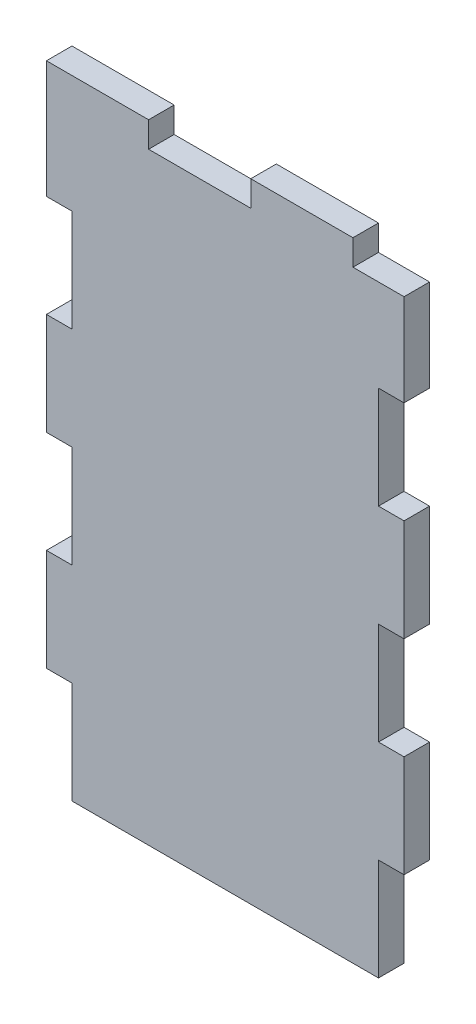
ISO-10303-21;
HEADER;
FILE_DESCRIPTION(('STEP AP214'),'2;1');
FILE_NAME('part.step','',(''),(''),'','','');
FILE_SCHEMA(('AUTOMOTIVE_DESIGN { 1 0 10303 214 1 1 1 1 }'));
ENDSEC;
DATA;
#1=APPLICATION_CONTEXT('core data for automotive mechanical design processes');
#2=APPLICATION_PROTOCOL_DEFINITION('international standard','automotive_design',2000,#1);
#3=PRODUCT_CONTEXT('',#1,'mechanical');
#4=PRODUCT('Part','Part','',(#3));
#5=PRODUCT_RELATED_PRODUCT_CATEGORY('part','',(#4));
#6=PRODUCT_DEFINITION_FORMATION('','',#4);
#7=PRODUCT_DEFINITION_CONTEXT('part definition',#1,'design');
#8=PRODUCT_DEFINITION('design','',#6,#7);
#9=PRODUCT_DEFINITION_SHAPE('','',#8);
#10=(LENGTH_UNIT() NAMED_UNIT(*) SI_UNIT(.MILLI.,.METRE.));
#11=(NAMED_UNIT(*) PLANE_ANGLE_UNIT() SI_UNIT($,.RADIAN.));
#12=(NAMED_UNIT(*) SI_UNIT($,.STERADIAN.) SOLID_ANGLE_UNIT());
#13=UNCERTAINTY_MEASURE_WITH_UNIT(LENGTH_MEASURE(1.E-05),#10,'distance_accuracy_value','');
#14=(GEOMETRIC_REPRESENTATION_CONTEXT(3) GLOBAL_UNCERTAINTY_ASSIGNED_CONTEXT((#13)) GLOBAL_UNIT_ASSIGNED_CONTEXT((#10,
#11,#12)) REPRESENTATION_CONTEXT('',''));
#15=CARTESIAN_POINT('',(0.,0.,0.));
#16=DIRECTION('',(0.,0.,1.));
#17=DIRECTION('',(1.,0.,0.));
#18=AXIS2_PLACEMENT_3D('',#15,#16,#17);
#19=CARTESIAN_POINT('',(-35.,59.,5.));
#20=DIRECTION('',(0.,-1.,0.));
#21=DIRECTION('',(0.,0.,-1.));
#22=AXIS2_PLACEMENT_3D('',#19,#20,#21);
#23=PLANE('',#22);
#24=DIRECTION('',(-1.,0.,0.));
#25=VECTOR('',#24,1.);
#26=CARTESIAN_POINT('',(-35.,59.,5.));
#27=LINE('',#26,#25);
#28=CARTESIAN_POINT('',(4.99999999999998,59.,5.));
#29=VERTEX_POINT('',#28);
#30=CARTESIAN_POINT('',(-15.,59.,5.));
#31=VERTEX_POINT('',#30);
#32=EDGE_CURVE('E57',#29,#31,#27,.T.);
#33=ORIENTED_EDGE('',*,*,#32,.F.);
#34=DIRECTION('',(0.,0.,1.));
#35=VECTOR('',#34,1.);
#36=CARTESIAN_POINT('',(4.99999999999998,59.,-20.6155281280883));
#37=LINE('',#36,#35);
#38=CARTESIAN_POINT('',(4.99999999999998,59.,0.));
#39=VERTEX_POINT('',#38);
#40=EDGE_CURVE('E268',#39,#29,#37,.T.);
#41=ORIENTED_EDGE('',*,*,#40,.F.);
#42=DIRECTION('',(-1.,0.,0.));
#43=VECTOR('',#42,1.);
#44=CARTESIAN_POINT('',(-35.,59.,0.));
#45=LINE('',#44,#43);
#46=CARTESIAN_POINT('',(-15.,59.,0.));
#47=VERTEX_POINT('',#46);
#48=EDGE_CURVE('E518',#39,#47,#45,.T.);
#49=ORIENTED_EDGE('',*,*,#48,.T.);
#50=DIRECTION('',(0.,0.,1.));
#51=VECTOR('',#50,1.);
#52=CARTESIAN_POINT('',(-15.,59.,-20.6155281280883));
#53=LINE('',#52,#51);
#54=EDGE_CURVE('E296',#47,#31,#53,.T.);
#55=ORIENTED_EDGE('',*,*,#54,.T.);
#56=EDGE_LOOP('',(#33,#41,#49,#55));
#57=FACE_BOUND('',#56,.T.);
#58=ADVANCED_FACE('F41',(#57),#23,.F.);
#59=CARTESIAN_POINT('',(35.,59.,5.));
#60=DIRECTION('',(-1.,0.,0.));
#61=DIRECTION('',(0.,-1.,0.));
#62=AXIS2_PLACEMENT_3D('',#59,#60,#61);
#63=PLANE('',#62);
#64=DIRECTION('',(0.,1.,0.));
#65=VECTOR('',#64,1.);
#66=CARTESIAN_POINT('',(35.,59.,5.));
#67=LINE('',#66,#65);
#68=CARTESIAN_POINT('',(35.,1.00000000000002,5.));
#69=VERTEX_POINT('',#68);
#70=CARTESIAN_POINT('',(35.,21.,5.));
#71=VERTEX_POINT('',#70);
#72=EDGE_CURVE('E501',#69,#71,#67,.T.);
#73=ORIENTED_EDGE('',*,*,#72,.F.);
#74=DIRECTION('',(0.,0.,1.));
#75=VECTOR('',#74,1.);
#76=CARTESIAN_POINT('',(35.,1.00000000000002,-0.00100000000000013));
#77=LINE('',#76,#75);
#78=CARTESIAN_POINT('',(35.,1.00000000000002,0.));
#79=VERTEX_POINT('',#78);
#80=EDGE_CURVE('E329',#79,#69,#77,.T.);
#81=ORIENTED_EDGE('',*,*,#80,.F.);
#82=DIRECTION('',(0.,1.,0.));
#83=VECTOR('',#82,1.);
#84=CARTESIAN_POINT('',(35.,59.,0.));
#85=LINE('',#84,#83);
#86=CARTESIAN_POINT('',(35.,21.,0.));
#87=VERTEX_POINT('',#86);
#88=EDGE_CURVE('E519',#79,#87,#85,.T.);
#89=ORIENTED_EDGE('',*,*,#88,.T.);
#90=DIRECTION('',(0.,0.,1.));
#91=VECTOR('',#90,1.);
#92=CARTESIAN_POINT('',(35.,21.,-0.00100000000000013));
#93=LINE('',#92,#91);
#94=EDGE_CURVE('E366',#87,#71,#93,.T.);
#95=ORIENTED_EDGE('',*,*,#94,.T.);
#96=EDGE_LOOP('',(#73,#81,#89,#95));
#97=FACE_BOUND('',#96,.T.);
#98=ADVANCED_FACE('F544',(#97),#63,.F.);
#99=CARTESIAN_POINT('',(35.,41.,5.));
#100=VERTEX_POINT('',#99);
#101=CARTESIAN_POINT('',(35.,59.,5.));
#102=VERTEX_POINT('',#101);
#103=EDGE_CURVE('E502',#100,#102,#67,.T.);
#104=ORIENTED_EDGE('',*,*,#103,.F.);
#105=DIRECTION('',(0.,0.,1.));
#106=VECTOR('',#105,1.);
#107=CARTESIAN_POINT('',(35.,41.,-0.00100000000000013));
#108=LINE('',#107,#106);
#109=CARTESIAN_POINT('',(35.,41.,0.));
#110=VERTEX_POINT('',#109);
#111=EDGE_CURVE('E363',#110,#100,#108,.T.);
#112=ORIENTED_EDGE('',*,*,#111,.F.);
#113=CARTESIAN_POINT('',(35.,59.,0.));
#114=VERTEX_POINT('',#113);
#115=EDGE_CURVE('E496',#110,#114,#85,.T.);
#116=ORIENTED_EDGE('',*,*,#115,.T.);
#117=DIRECTION('',(0.,0.,-1.));
#118=VECTOR('',#117,1.);
#119=CARTESIAN_POINT('',(35.,59.,5.));
#120=LINE('',#119,#118);
#121=EDGE_CURVE('E11',#102,#114,#120,.T.);
#122=ORIENTED_EDGE('',*,*,#121,.F.);
#123=EDGE_LOOP('',(#104,#112,#116,#122));
#124=FACE_BOUND('',#123,.T.);
#125=ADVANCED_FACE('F562',(#124),#63,.F.);
#126=CARTESIAN_POINT('',(-35.,59.,5.));
#127=DIRECTION('',(1.,0.,0.));
#128=DIRECTION('',(0.,1.,0.));
#129=AXIS2_PLACEMENT_3D('',#126,#127,#128);
#130=PLANE('',#129);
#131=DIRECTION('',(0.,0.,-1.));
#132=VECTOR('',#131,1.);
#133=CARTESIAN_POINT('',(-35.,-19.,5.000012));
#134=LINE('',#133,#132);
#135=CARTESIAN_POINT('',(-35.,-19.,5.));
#136=VERTEX_POINT('',#135);
#137=CARTESIAN_POINT('',(-35.,-19.,0.));
#138=VERTEX_POINT('',#137);
#139=EDGE_CURVE('E420',#136,#138,#134,.T.);
#140=ORIENTED_EDGE('',*,*,#139,.T.);
#141=DIRECTION('',(0.,-1.,0.));
#142=VECTOR('',#141,1.);
#143=CARTESIAN_POINT('',(-35.,59.,0.));
#144=LINE('',#143,#142);
#145=CARTESIAN_POINT('',(-35.,-39.,0.));
#146=VERTEX_POINT('',#145);
#147=EDGE_CURVE('E523',#138,#146,#144,.T.);
#148=ORIENTED_EDGE('',*,*,#147,.T.);
#149=DIRECTION('',(0.,0.,-1.));
#150=VECTOR('',#149,1.);
#151=CARTESIAN_POINT('',(-35.,-39.,5.000012));
#152=LINE('',#151,#150);
#153=CARTESIAN_POINT('',(-35.,-39.,5.));
#154=VERTEX_POINT('',#153);
#155=EDGE_CURVE('E477',#154,#146,#152,.T.);
#156=ORIENTED_EDGE('',*,*,#155,.F.);
#157=DIRECTION('',(0.,-1.,0.));
#158=VECTOR('',#157,1.);
#159=CARTESIAN_POINT('',(-35.,59.,5.));
#160=LINE('',#159,#158);
#161=EDGE_CURVE('E505',#136,#154,#160,.T.);
#162=ORIENTED_EDGE('',*,*,#161,.F.);
#163=EDGE_LOOP('',(#140,#148,#156,#162));
#164=FACE_BOUND('',#163,.T.);
#165=ADVANCED_FACE('F619',(#164),#130,.F.);
#166=DIRECTION('',(0.,0.,-1.));
#167=VECTOR('',#166,1.);
#168=CARTESIAN_POINT('',(-35.,1.00000000000002,5.000012));
#169=LINE('',#168,#167);
#170=CARTESIAN_POINT('',(-35.,1.00000000000002,5.));
#171=VERTEX_POINT('',#170);
#172=CARTESIAN_POINT('',(-35.,1.00000000000002,0.));
#173=VERTEX_POINT('',#172);
#174=EDGE_CURVE('E411',#171,#173,#169,.T.);
#175=ORIENTED_EDGE('',*,*,#174,.F.);
#176=CARTESIAN_POINT('',(-35.,21.,5.));
#177=VERTEX_POINT('',#176);
#178=EDGE_CURVE('E510',#177,#171,#160,.T.);
#179=ORIENTED_EDGE('',*,*,#178,.F.);
#180=DIRECTION('',(0.,0.,-1.));
#181=VECTOR('',#180,1.);
#182=CARTESIAN_POINT('',(-35.,21.,5.000012));
#183=LINE('',#182,#181);
#184=CARTESIAN_POINT('',(-35.,21.,0.));
#185=VERTEX_POINT('',#184);
#186=EDGE_CURVE('E404',#177,#185,#183,.T.);
#187=ORIENTED_EDGE('',*,*,#186,.T.);
#188=EDGE_CURVE('E528',#185,#173,#144,.T.);
#189=ORIENTED_EDGE('',*,*,#188,.T.);
#190=EDGE_LOOP('',(#175,#179,#187,#189));
#191=FACE_BOUND('',#190,.T.);
#192=ADVANCED_FACE('F606',(#191),#130,.F.);
#193=DIRECTION('',(0.,0.,-1.));
#194=VECTOR('',#193,1.);
#195=CARTESIAN_POINT('',(-35.,41.,5.000012));
#196=LINE('',#195,#194);
#197=CARTESIAN_POINT('',(-35.,41.,5.));
#198=VERTEX_POINT('',#197);
#199=CARTESIAN_POINT('',(-35.,41.,0.));
#200=VERTEX_POINT('',#199);
#201=EDGE_CURVE('E435',#198,#200,#196,.T.);
#202=ORIENTED_EDGE('',*,*,#201,.F.);
#203=CARTESIAN_POINT('',(-35.,64.,5.));
#204=VERTEX_POINT('',#203);
#205=EDGE_CURVE('E506',#204,#198,#160,.T.);
#206=ORIENTED_EDGE('',*,*,#205,.F.);
#207=DIRECTION('',(0.,0.,1.));
#208=VECTOR('',#207,1.);
#209=CARTESIAN_POINT('',(-35.,64.,-20.6155281280883));
#210=LINE('',#209,#208);
#211=CARTESIAN_POINT('',(-35.,64.,0.));
#212=VERTEX_POINT('',#211);
#213=EDGE_CURVE('E283',#212,#204,#210,.T.);
#214=ORIENTED_EDGE('',*,*,#213,.F.);
#215=EDGE_CURVE('E524',#212,#200,#144,.T.);
#216=ORIENTED_EDGE('',*,*,#215,.T.);
#217=EDGE_LOOP('',(#202,#206,#214,#216));
#218=FACE_BOUND('',#217,.T.);
#219=ADVANCED_FACE('F590',(#218),#130,.F.);
#220=CARTESIAN_POINT('',(0.,0.,5.));
#221=DIRECTION('',(0.,0.,1.));
#222=DIRECTION('',(1.,0.,0.));
#223=AXIS2_PLACEMENT_3D('',#220,#221,#222);
#224=PLANE('',#223);
#225=DIRECTION('',(-1.,0.,0.));
#226=VECTOR('',#225,1.);
#227=CARTESIAN_POINT('',(30.,1.00000000000002,5.));
#228=LINE('',#227,#226);
#229=CARTESIAN_POINT('',(30.,1.00000000000002,5.));
#230=VERTEX_POINT('',#229);
#231=EDGE_CURVE('E320',#69,#230,#228,.T.);
#232=ORIENTED_EDGE('',*,*,#231,.F.);
#233=ORIENTED_EDGE('',*,*,#72,.T.);
#234=DIRECTION('',(1.,0.,0.));
#235=VECTOR('',#234,1.);
#236=CARTESIAN_POINT('',(30.,21.,5.));
#237=LINE('',#236,#235);
#238=CARTESIAN_POINT('',(30.,21.,5.));
#239=VERTEX_POINT('',#238);
#240=EDGE_CURVE('E352',#239,#71,#237,.T.);
#241=ORIENTED_EDGE('',*,*,#240,.F.);
#242=DIRECTION('',(0.,-1.,0.));
#243=VECTOR('',#242,1.);
#244=CARTESIAN_POINT('',(30.,21.,5.));
#245=LINE('',#244,#243);
#246=CARTESIAN_POINT('',(30.,41.,5.));
#247=VERTEX_POINT('',#246);
#248=EDGE_CURVE('E348',#247,#239,#245,.T.);
#249=ORIENTED_EDGE('',*,*,#248,.F.);
#250=DIRECTION('',(-1.,0.,0.));
#251=VECTOR('',#250,1.);
#252=CARTESIAN_POINT('',(30.,41.,5.));
#253=LINE('',#252,#251);
#254=EDGE_CURVE('E355',#100,#247,#253,.T.);
#255=ORIENTED_EDGE('',*,*,#254,.F.);
#256=ORIENTED_EDGE('',*,*,#103,.T.);
#257=CARTESIAN_POINT('',(25.,59.,5.));
#258=VERTEX_POINT('',#257);
#259=EDGE_CURVE('E260',#102,#258,#27,.T.);
#260=ORIENTED_EDGE('',*,*,#259,.T.);
#261=DIRECTION('',(0.,1.,0.));
#262=VECTOR('',#261,1.);
#263=CARTESIAN_POINT('',(25.,64.,5.));
#264=LINE('',#263,#262);
#265=CARTESIAN_POINT('',(25.,64.,5.));
#266=VERTEX_POINT('',#265);
#267=EDGE_CURVE('E245',#258,#266,#264,.T.);
#268=ORIENTED_EDGE('',*,*,#267,.T.);
#269=DIRECTION('',(-1.,0.,0.));
#270=VECTOR('',#269,1.);
#271=CARTESIAN_POINT('',(4.99999999999998,64.,5.));
#272=LINE('',#271,#270);
#273=CARTESIAN_POINT('',(4.99999999999998,64.,5.));
#274=VERTEX_POINT('',#273);
#275=EDGE_CURVE('E259',#266,#274,#272,.T.);
#276=ORIENTED_EDGE('',*,*,#275,.T.);
#277=DIRECTION('',(0.,-1.,0.));
#278=VECTOR('',#277,1.);
#279=CARTESIAN_POINT('',(4.99999999999998,64.,5.));
#280=LINE('',#279,#278);
#281=EDGE_CURVE('E262',#274,#29,#280,.T.);
#282=ORIENTED_EDGE('',*,*,#281,.T.);
#283=ORIENTED_EDGE('',*,*,#32,.T.);
#284=DIRECTION('',(0.,1.,0.));
#285=VECTOR('',#284,1.);
#286=CARTESIAN_POINT('',(-15.,64.,5.));
#287=LINE('',#286,#285);
#288=CARTESIAN_POINT('',(-15.,64.,5.));
#289=VERTEX_POINT('',#288);
#290=EDGE_CURVE('E287',#31,#289,#287,.T.);
#291=ORIENTED_EDGE('',*,*,#290,.T.);
#292=DIRECTION('',(-1.,0.,0.));
#293=VECTOR('',#292,1.);
#294=CARTESIAN_POINT('',(-35.,64.,5.));
#295=LINE('',#294,#293);
#296=EDGE_CURVE('E291',#289,#204,#295,.T.);
#297=ORIENTED_EDGE('',*,*,#296,.T.);
#298=ORIENTED_EDGE('',*,*,#205,.T.);
#299=DIRECTION('',(1.,0.,0.));
#300=VECTOR('',#299,1.);
#301=CARTESIAN_POINT('',(0.,41.,5.));
#302=LINE('',#301,#300);
#303=CARTESIAN_POINT('',(-30.,41.,5.));
#304=VERTEX_POINT('',#303);
#305=EDGE_CURVE('E424',#198,#304,#302,.T.);
#306=ORIENTED_EDGE('',*,*,#305,.T.);
#307=DIRECTION('',(0.,-1.,0.));
#308=VECTOR('',#307,1.);
#309=CARTESIAN_POINT('',(-30.,0.,5.));
#310=LINE('',#309,#308);
#311=CARTESIAN_POINT('',(-30.,21.,5.));
#312=VERTEX_POINT('',#311);
#313=EDGE_CURVE('E450',#304,#312,#310,.T.);
#314=ORIENTED_EDGE('',*,*,#313,.T.);
#315=DIRECTION('',(-1.,0.,0.));
#316=VECTOR('',#315,1.);
#317=CARTESIAN_POINT('',(0.,21.,5.));
#318=LINE('',#317,#316);
#319=EDGE_CURVE('E454',#312,#177,#318,.T.);
#320=ORIENTED_EDGE('',*,*,#319,.T.);
#321=ORIENTED_EDGE('',*,*,#178,.T.);
#322=DIRECTION('',(1.,0.,0.));
#323=VECTOR('',#322,1.);
#324=CARTESIAN_POINT('',(0.,1.00000000000002,5.));
#325=LINE('',#324,#323);
#326=CARTESIAN_POINT('',(-30.,1.00000000000002,5.));
#327=VERTEX_POINT('',#326);
#328=EDGE_CURVE('E458',#171,#327,#325,.T.);
#329=ORIENTED_EDGE('',*,*,#328,.T.);
#330=DIRECTION('',(0.,-1.,0.));
#331=VECTOR('',#330,1.);
#332=CARTESIAN_POINT('',(-30.,0.,5.));
#333=LINE('',#332,#331);
#334=CARTESIAN_POINT('',(-30.,-19.,5.));
#335=VERTEX_POINT('',#334);
#336=EDGE_CURVE('E462',#327,#335,#333,.T.);
#337=ORIENTED_EDGE('',*,*,#336,.T.);
#338=DIRECTION('',(-1.,0.,0.));
#339=VECTOR('',#338,1.);
#340=CARTESIAN_POINT('',(0.,-19.,5.));
#341=LINE('',#340,#339);
#342=EDGE_CURVE('E466',#335,#136,#341,.T.);
#343=ORIENTED_EDGE('',*,*,#342,.T.);
#344=ORIENTED_EDGE('',*,*,#161,.T.);
#345=DIRECTION('',(1.,0.,0.));
#346=VECTOR('',#345,1.);
#347=CARTESIAN_POINT('',(0.,-39.,5.));
#348=LINE('',#347,#346);
#349=CARTESIAN_POINT('',(-30.,-39.,5.));
#350=VERTEX_POINT('',#349);
#351=EDGE_CURVE('E488',#154,#350,#348,.T.);
#352=ORIENTED_EDGE('',*,*,#351,.T.);
#353=DIRECTION('',(0.,-1.,0.));
#354=VECTOR('',#353,1.);
#355=CARTESIAN_POINT('',(-30.,0.,5.));
#356=LINE('',#355,#354);
#357=CARTESIAN_POINT('',(-30.,-59.,5.));
#358=VERTEX_POINT('',#357);
#359=EDGE_CURVE('E492',#350,#358,#356,.T.);
#360=ORIENTED_EDGE('',*,*,#359,.T.);
#361=DIRECTION('',(1.,0.,0.));
#362=VECTOR('',#361,1.);
#363=CARTESIAN_POINT('',(-35.,-59.,5.));
#364=LINE('',#363,#362);
#365=CARTESIAN_POINT('',(30.,-59.,5.));
#366=VERTEX_POINT('',#365);
#367=EDGE_CURVE('E50',#358,#366,#364,.T.);
#368=ORIENTED_EDGE('',*,*,#367,.T.);
#369=DIRECTION('',(0.,-1.,0.));
#370=VECTOR('',#369,1.);
#371=CARTESIAN_POINT('',(30.,-59.,5.));
#372=LINE('',#371,#370);
#373=CARTESIAN_POINT('',(30.,-39.,5.));
#374=VERTEX_POINT('',#373);
#375=EDGE_CURVE('E381',#374,#366,#372,.T.);
#376=ORIENTED_EDGE('',*,*,#375,.F.);
#377=DIRECTION('',(-1.,0.,0.));
#378=VECTOR('',#377,1.);
#379=CARTESIAN_POINT('',(30.,-39.,5.));
#380=LINE('',#379,#378);
#381=CARTESIAN_POINT('',(35.,-39.,5.));
#382=VERTEX_POINT('',#381);
#383=EDGE_CURVE('E384',#382,#374,#380,.T.);
#384=ORIENTED_EDGE('',*,*,#383,.F.);
#385=CARTESIAN_POINT('',(35.,-19.,5.));
#386=VERTEX_POINT('',#385);
#387=EDGE_CURVE('E497',#382,#386,#67,.T.);
#388=ORIENTED_EDGE('',*,*,#387,.T.);
#389=DIRECTION('',(1.,0.,0.));
#390=VECTOR('',#389,1.);
#391=CARTESIAN_POINT('',(30.,-19.,5.));
#392=LINE('',#391,#390);
#393=CARTESIAN_POINT('',(30.,-19.,5.));
#394=VERTEX_POINT('',#393);
#395=EDGE_CURVE('E317',#394,#386,#392,.T.);
#396=ORIENTED_EDGE('',*,*,#395,.F.);
#397=DIRECTION('',(0.,-1.,0.));
#398=VECTOR('',#397,1.);
#399=CARTESIAN_POINT('',(30.,-19.,5.));
#400=LINE('',#399,#398);
#401=EDGE_CURVE('E313',#230,#394,#400,.T.);
#402=ORIENTED_EDGE('',*,*,#401,.F.);
#403=EDGE_LOOP('',(#232,#233,#241,#249,#255,#256,#260,#268,#276,#282,#283,#291,#297,#298,#306,
#314,#320,#321,#329,#337,#343,#344,#352,#360,#368,#376,#384,#388,#396,#402));
#404=FACE_BOUND('',#403,.T.);
#405=ADVANCED_FACE('F257',(#404),#224,.T.);
#406=CARTESIAN_POINT('',(0.,0.,0.));
#407=DIRECTION('',(0.,0.,1.));
#408=DIRECTION('',(1.,0.,0.));
#409=AXIS2_PLACEMENT_3D('',#406,#407,#408);
#410=PLANE('',#409);
#411=ORIENTED_EDGE('',*,*,#88,.F.);
#412=DIRECTION('',(1.,0.,0.));
#413=VECTOR('',#412,1.);
#414=CARTESIAN_POINT('',(30.,1.00000000000002,0.));
#415=LINE('',#414,#413);
#416=CARTESIAN_POINT('',(30.,1.00000000000002,0.));
#417=VERTEX_POINT('',#416);
#418=EDGE_CURVE('E309',#417,#79,#415,.T.);
#419=ORIENTED_EDGE('',*,*,#418,.F.);
#420=DIRECTION('',(0.,1.,0.));
#421=VECTOR('',#420,1.);
#422=CARTESIAN_POINT('',(30.,-19.,0.));
#423=LINE('',#422,#421);
#424=CARTESIAN_POINT('',(30.,-19.,0.));
#425=VERTEX_POINT('',#424);
#426=EDGE_CURVE('E305',#425,#417,#423,.T.);
#427=ORIENTED_EDGE('',*,*,#426,.F.);
#428=DIRECTION('',(-1.,0.,0.));
#429=VECTOR('',#428,1.);
#430=CARTESIAN_POINT('',(30.,-19.,0.));
#431=LINE('',#430,#429);
#432=CARTESIAN_POINT('',(35.,-19.,0.));
#433=VERTEX_POINT('',#432);
#434=EDGE_CURVE('E328',#433,#425,#431,.T.);
#435=ORIENTED_EDGE('',*,*,#434,.F.);
#436=CARTESIAN_POINT('',(35.,-39.,0.));
#437=VERTEX_POINT('',#436);
#438=EDGE_CURVE('E514',#437,#433,#85,.T.);
#439=ORIENTED_EDGE('',*,*,#438,.F.);
#440=DIRECTION('',(1.,0.,0.));
#441=VECTOR('',#440,1.);
#442=CARTESIAN_POINT('',(30.,-39.,0.));
#443=LINE('',#442,#441);
#444=CARTESIAN_POINT('',(30.,-39.,0.));
#445=VERTEX_POINT('',#444);
#446=EDGE_CURVE('E341',#445,#437,#443,.T.);
#447=ORIENTED_EDGE('',*,*,#446,.F.);
#448=DIRECTION('',(0.,1.,0.));
#449=VECTOR('',#448,1.);
#450=CARTESIAN_POINT('',(30.,-59.,0.));
#451=LINE('',#450,#449);
#452=CARTESIAN_POINT('',(30.,-59.,0.));
#453=VERTEX_POINT('',#452);
#454=EDGE_CURVE('E377',#453,#445,#451,.T.);
#455=ORIENTED_EDGE('',*,*,#454,.F.);
#456=DIRECTION('',(1.,0.,0.));
#457=VECTOR('',#456,1.);
#458=CARTESIAN_POINT('',(-35.,-59.,0.));
#459=LINE('',#458,#457);
#460=CARTESIAN_POINT('',(-30.,-59.,0.));
#461=VERTEX_POINT('',#460);
#462=EDGE_CURVE('E527',#461,#453,#459,.T.);
#463=ORIENTED_EDGE('',*,*,#462,.F.);
#464=DIRECTION('',(0.,-1.,0.));
#465=VECTOR('',#464,1.);
#466=CARTESIAN_POINT('',(-30.,-59.,0.));
#467=LINE('',#466,#465);
#468=CARTESIAN_POINT('',(-30.,-39.,0.));
#469=VERTEX_POINT('',#468);
#470=EDGE_CURVE('E470',#469,#461,#467,.T.);
#471=ORIENTED_EDGE('',*,*,#470,.F.);
#472=DIRECTION('',(1.,0.,0.));
#473=VECTOR('',#472,1.);
#474=CARTESIAN_POINT('',(-35.,-39.,0.));
#475=LINE('',#474,#473);
#476=EDGE_CURVE('E473',#146,#469,#475,.T.);
#477=ORIENTED_EDGE('',*,*,#476,.F.);
#478=ORIENTED_EDGE('',*,*,#147,.F.);
#479=DIRECTION('',(-1.,0.,0.));
#480=VECTOR('',#479,1.);
#481=CARTESIAN_POINT('',(-35.,-19.,0.));
#482=LINE('',#481,#480);
#483=CARTESIAN_POINT('',(-30.,-19.,0.));
#484=VERTEX_POINT('',#483);
#485=EDGE_CURVE('E408',#484,#138,#482,.T.);
#486=ORIENTED_EDGE('',*,*,#485,.F.);
#487=DIRECTION('',(0.,-1.,0.));
#488=VECTOR('',#487,1.);
#489=CARTESIAN_POINT('',(-30.,-19.,0.));
#490=LINE('',#489,#488);
#491=CARTESIAN_POINT('',(-30.,1.00000000000002,0.));
#492=VERTEX_POINT('',#491);
#493=EDGE_CURVE('E399',#492,#484,#490,.T.);
#494=ORIENTED_EDGE('',*,*,#493,.F.);
#495=DIRECTION('',(1.,0.,0.));
#496=VECTOR('',#495,1.);
#497=CARTESIAN_POINT('',(-35.,1.00000000000002,0.));
#498=LINE('',#497,#496);
#499=EDGE_CURVE('E403',#173,#492,#498,.T.);
#500=ORIENTED_EDGE('',*,*,#499,.F.);
#501=ORIENTED_EDGE('',*,*,#188,.F.);
#502=DIRECTION('',(-1.,0.,0.));
#503=VECTOR('',#502,1.);
#504=CARTESIAN_POINT('',(-35.,21.,0.));
#505=LINE('',#504,#503);
#506=CARTESIAN_POINT('',(-30.,21.,0.));
#507=VERTEX_POINT('',#506);
#508=EDGE_CURVE('E432',#507,#185,#505,.T.);
#509=ORIENTED_EDGE('',*,*,#508,.F.);
#510=DIRECTION('',(0.,-1.,0.));
#511=VECTOR('',#510,1.);
#512=CARTESIAN_POINT('',(-30.,21.,0.));
#513=LINE('',#512,#511);
#514=CARTESIAN_POINT('',(-30.,41.,0.));
#515=VERTEX_POINT('',#514);
#516=EDGE_CURVE('E392',#515,#507,#513,.T.);
#517=ORIENTED_EDGE('',*,*,#516,.F.);
#518=DIRECTION('',(1.,0.,0.));
#519=VECTOR('',#518,1.);
#520=CARTESIAN_POINT('',(-35.,41.,0.));
#521=LINE('',#520,#519);
#522=EDGE_CURVE('E428',#200,#515,#521,.T.);
#523=ORIENTED_EDGE('',*,*,#522,.F.);
#524=ORIENTED_EDGE('',*,*,#215,.F.);
#525=DIRECTION('',(1.,0.,0.));
#526=VECTOR('',#525,1.);
#527=CARTESIAN_POINT('',(-35.,64.,0.));
#528=LINE('',#527,#526);
#529=CARTESIAN_POINT('',(-15.,64.,0.));
#530=VERTEX_POINT('',#529);
#531=EDGE_CURVE('E282',#212,#530,#528,.T.);
#532=ORIENTED_EDGE('',*,*,#531,.T.);
#533=DIRECTION('',(0.,-1.,0.));
#534=VECTOR('',#533,1.);
#535=CARTESIAN_POINT('',(-15.,64.,0.));
#536=LINE('',#535,#534);
#537=EDGE_CURVE('E278',#530,#47,#536,.T.);
#538=ORIENTED_EDGE('',*,*,#537,.T.);
#539=ORIENTED_EDGE('',*,*,#48,.F.);
#540=DIRECTION('',(0.,1.,0.));
#541=VECTOR('',#540,1.);
#542=CARTESIAN_POINT('',(4.99999999999998,64.,0.));
#543=LINE('',#542,#541);
#544=CARTESIAN_POINT('',(4.99999999999998,64.,0.));
#545=VERTEX_POINT('',#544);
#546=EDGE_CURVE('E292',#39,#545,#543,.T.);
#547=ORIENTED_EDGE('',*,*,#546,.T.);
#548=DIRECTION('',(1.,0.,0.));
#549=VECTOR('',#548,1.);
#550=CARTESIAN_POINT('',(4.99999999999998,64.,0.));
#551=LINE('',#550,#549);
#552=CARTESIAN_POINT('',(25.,64.,0.));
#553=VERTEX_POINT('',#552);
#554=EDGE_CURVE('E565',#545,#553,#551,.T.);
#555=ORIENTED_EDGE('',*,*,#554,.T.);
#556=DIRECTION('',(0.,-1.,0.));
#557=VECTOR('',#556,1.);
#558=CARTESIAN_POINT('',(25.,64.,0.));
#559=LINE('',#558,#557);
#560=CARTESIAN_POINT('',(25.,59.,0.));
#561=VERTEX_POINT('',#560);
#562=EDGE_CURVE('E247',#553,#561,#559,.T.);
#563=ORIENTED_EDGE('',*,*,#562,.T.);
#564=EDGE_CURVE('E520',#114,#561,#45,.T.);
#565=ORIENTED_EDGE('',*,*,#564,.F.);
#566=ORIENTED_EDGE('',*,*,#115,.F.);
#567=DIRECTION('',(1.,0.,0.));
#568=VECTOR('',#567,1.);
#569=CARTESIAN_POINT('',(30.,41.,0.));
#570=LINE('',#569,#568);
#571=CARTESIAN_POINT('',(30.,41.,0.));
#572=VERTEX_POINT('',#571);
#573=EDGE_CURVE('E345',#572,#110,#570,.T.);
#574=ORIENTED_EDGE('',*,*,#573,.F.);
#575=DIRECTION('',(0.,1.,0.));
#576=VECTOR('',#575,1.);
#577=CARTESIAN_POINT('',(30.,21.,0.));
#578=LINE('',#577,#576);
#579=CARTESIAN_POINT('',(30.,21.,0.));
#580=VERTEX_POINT('',#579);
#581=EDGE_CURVE('E286',#580,#572,#578,.T.);
#582=ORIENTED_EDGE('',*,*,#581,.F.);
#583=DIRECTION('',(-1.,0.,0.));
#584=VECTOR('',#583,1.);
#585=CARTESIAN_POINT('',(30.,21.,0.));
#586=LINE('',#585,#584);
#587=EDGE_CURVE('E310',#87,#580,#586,.T.);
#588=ORIENTED_EDGE('',*,*,#587,.F.);
#589=EDGE_LOOP('',(#411,#419,#427,#435,#439,#447,#455,#463,#471,#477,#478,#486,#494,#500,#501,
#509,#517,#523,#524,#532,#538,#539,#547,#555,#563,#565,#566,#574,#582,#588));
#590=FACE_BOUND('',#589,.T.);
#591=ADVANCED_FACE('F552',(#590),#410,.F.);
#592=CARTESIAN_POINT('',(-35.,-59.,5.));
#593=DIRECTION('',(0.,1.,0.));
#594=DIRECTION('',(0.,0.,1.));
#595=AXIS2_PLACEMENT_3D('',#592,#593,#594);
#596=PLANE('',#595);
#597=ORIENTED_EDGE('',*,*,#462,.T.);
#598=DIRECTION('',(0.,0.,1.));
#599=VECTOR('',#598,1.);
#600=CARTESIAN_POINT('',(30.,-59.,-0.00100000000000013));
#601=LINE('',#600,#599);
#602=EDGE_CURVE('E388',#453,#366,#601,.T.);
#603=ORIENTED_EDGE('',*,*,#602,.T.);
#604=ORIENTED_EDGE('',*,*,#367,.F.);
#605=DIRECTION('',(0.,0.,-1.));
#606=VECTOR('',#605,1.);
#607=CARTESIAN_POINT('',(-30.,-59.,5.000012));
#608=LINE('',#607,#606);
#609=EDGE_CURVE('E484',#358,#461,#608,.T.);
#610=ORIENTED_EDGE('',*,*,#609,.T.);
#611=EDGE_LOOP('',(#597,#603,#604,#610));
#612=FACE_BOUND('',#611,.T.);
#613=ADVANCED_FACE('F655',(#612),#596,.F.);
#614=ORIENTED_EDGE('',*,*,#438,.T.);
#615=DIRECTION('',(0.,0.,1.));
#616=VECTOR('',#615,1.);
#617=CARTESIAN_POINT('',(35.,-19.,-0.00100000000000013));
#618=LINE('',#617,#616);
#619=EDGE_CURVE('E332',#433,#386,#618,.T.);
#620=ORIENTED_EDGE('',*,*,#619,.T.);
#621=ORIENTED_EDGE('',*,*,#387,.F.);
#622=DIRECTION('',(0.,0.,1.));
#623=VECTOR('',#622,1.);
#624=CARTESIAN_POINT('',(35.,-39.,-0.00100000000000013));
#625=LINE('',#624,#623);
#626=EDGE_CURVE('E393',#437,#382,#625,.T.);
#627=ORIENTED_EDGE('',*,*,#626,.F.);
#628=EDGE_LOOP('',(#614,#620,#621,#627));
#629=FACE_BOUND('',#628,.T.);
#630=ADVANCED_FACE('F43',(#629),#63,.F.);
#631=ORIENTED_EDGE('',*,*,#564,.T.);
#632=DIRECTION('',(0.,0.,1.));
#633=VECTOR('',#632,1.);
#634=CARTESIAN_POINT('',(25.,59.,-20.6155281280883));
#635=LINE('',#634,#633);
#636=EDGE_CURVE('E65',#561,#258,#635,.T.);
#637=ORIENTED_EDGE('',*,*,#636,.T.);
#638=ORIENTED_EDGE('',*,*,#259,.F.);
#639=ORIENTED_EDGE('',*,*,#121,.T.);
#640=EDGE_LOOP('',(#631,#637,#638,#639));
#641=FACE_BOUND('',#640,.T.);
#642=ADVANCED_FACE('F564',(#641),#23,.F.);
#643=CARTESIAN_POINT('',(-30.,-59.,5.000012));
#644=DIRECTION('',(-1.,0.,0.));
#645=DIRECTION('',(0.,0.,1.));
#646=AXIS2_PLACEMENT_3D('',#643,#644,#645);
#647=PLANE('',#646);
#648=DIRECTION('',(0.,0.,-1.));
#649=VECTOR('',#648,1.);
#650=CARTESIAN_POINT('',(-30.,-39.,5.000012));
#651=LINE('',#650,#649);
#652=EDGE_CURVE('E481',#350,#469,#651,.T.);
#653=ORIENTED_EDGE('',*,*,#652,.T.);
#654=ORIENTED_EDGE('',*,*,#470,.T.);
#655=ORIENTED_EDGE('',*,*,#609,.F.);
#656=ORIENTED_EDGE('',*,*,#359,.F.);
#657=EDGE_LOOP('',(#653,#654,#655,#656));
#658=FACE_BOUND('',#657,.T.);
#659=ADVANCED_FACE('F648',(#658),#647,.T.);
#660=CARTESIAN_POINT('',(-35.,-39.,5.000012));
#661=DIRECTION('',(0.,-1.,0.));
#662=DIRECTION('',(0.,0.,-1.));
#663=AXIS2_PLACEMENT_3D('',#660,#661,#662);
#664=PLANE('',#663);
#665=ORIENTED_EDGE('',*,*,#155,.T.);
#666=ORIENTED_EDGE('',*,*,#476,.T.);
#667=ORIENTED_EDGE('',*,*,#652,.F.);
#668=ORIENTED_EDGE('',*,*,#351,.F.);
#669=EDGE_LOOP('',(#665,#666,#667,#668));
#670=FACE_BOUND('',#669,.T.);
#671=ADVANCED_FACE('F617',(#670),#664,.T.);
#672=CARTESIAN_POINT('',(-35.,21.,5.000012));
#673=DIRECTION('',(0.,1.,0.));
#674=DIRECTION('',(0.,0.,1.));
#675=AXIS2_PLACEMENT_3D('',#672,#673,#674);
#676=PLANE('',#675);
#677=DIRECTION('',(0.,0.,-1.));
#678=VECTOR('',#677,1.);
#679=CARTESIAN_POINT('',(-30.,21.,5.000012));
#680=LINE('',#679,#678);
#681=EDGE_CURVE('E441',#312,#507,#680,.T.);
#682=ORIENTED_EDGE('',*,*,#681,.T.);
#683=ORIENTED_EDGE('',*,*,#508,.T.);
#684=ORIENTED_EDGE('',*,*,#186,.F.);
#685=ORIENTED_EDGE('',*,*,#319,.F.);
#686=EDGE_LOOP('',(#682,#683,#684,#685));
#687=FACE_BOUND('',#686,.T.);
#688=ADVANCED_FACE('F601',(#687),#676,.T.);
#689=CARTESIAN_POINT('',(-30.,21.,5.000012));
#690=DIRECTION('',(-1.,0.,0.));
#691=DIRECTION('',(0.,0.,1.));
#692=AXIS2_PLACEMENT_3D('',#689,#690,#691);
#693=PLANE('',#692);
#694=DIRECTION('',(0.,0.,-1.));
#695=VECTOR('',#694,1.);
#696=CARTESIAN_POINT('',(-30.,41.,5.000012));
#697=LINE('',#696,#695);
#698=EDGE_CURVE('E438',#304,#515,#697,.T.);
#699=ORIENTED_EDGE('',*,*,#698,.T.);
#700=ORIENTED_EDGE('',*,*,#516,.T.);
#701=ORIENTED_EDGE('',*,*,#681,.F.);
#702=ORIENTED_EDGE('',*,*,#313,.F.);
#703=EDGE_LOOP('',(#699,#700,#701,#702));
#704=FACE_BOUND('',#703,.T.);
#705=ADVANCED_FACE('F597',(#704),#693,.T.);
#706=CARTESIAN_POINT('',(-35.,41.,5.000012));
#707=DIRECTION('',(0.,-1.,0.));
#708=DIRECTION('',(0.,0.,-1.));
#709=AXIS2_PLACEMENT_3D('',#706,#707,#708);
#710=PLANE('',#709);
#711=ORIENTED_EDGE('',*,*,#201,.T.);
#712=ORIENTED_EDGE('',*,*,#522,.T.);
#713=ORIENTED_EDGE('',*,*,#698,.F.);
#714=ORIENTED_EDGE('',*,*,#305,.F.);
#715=EDGE_LOOP('',(#711,#712,#713,#714));
#716=FACE_BOUND('',#715,.T.);
#717=ADVANCED_FACE('F593',(#716),#710,.T.);
#718=CARTESIAN_POINT('',(-35.,-19.,5.000012));
#719=DIRECTION('',(0.,1.,0.));
#720=DIRECTION('',(0.,0.,1.));
#721=AXIS2_PLACEMENT_3D('',#718,#719,#720);
#722=PLANE('',#721);
#723=DIRECTION('',(0.,0.,-1.));
#724=VECTOR('',#723,1.);
#725=CARTESIAN_POINT('',(-30.,-19.,5.000012));
#726=LINE('',#725,#724);
#727=EDGE_CURVE('E417',#335,#484,#726,.T.);
#728=ORIENTED_EDGE('',*,*,#727,.T.);
#729=ORIENTED_EDGE('',*,*,#485,.T.);
#730=ORIENTED_EDGE('',*,*,#139,.F.);
#731=ORIENTED_EDGE('',*,*,#342,.F.);
#732=EDGE_LOOP('',(#728,#729,#730,#731));
#733=FACE_BOUND('',#732,.T.);
#734=ADVANCED_FACE('F633',(#733),#722,.T.);
#735=CARTESIAN_POINT('',(-30.,-19.,5.000012));
#736=DIRECTION('',(-1.,0.,0.));
#737=DIRECTION('',(0.,0.,1.));
#738=AXIS2_PLACEMENT_3D('',#735,#736,#737);
#739=PLANE('',#738);
#740=DIRECTION('',(0.,0.,-1.));
#741=VECTOR('',#740,1.);
#742=CARTESIAN_POINT('',(-30.,1.00000000000002,5.000012));
#743=LINE('',#742,#741);
#744=EDGE_CURVE('E414',#327,#492,#743,.T.);
#745=ORIENTED_EDGE('',*,*,#744,.T.);
#746=ORIENTED_EDGE('',*,*,#493,.T.);
#747=ORIENTED_EDGE('',*,*,#727,.F.);
#748=ORIENTED_EDGE('',*,*,#336,.F.);
#749=EDGE_LOOP('',(#745,#746,#747,#748));
#750=FACE_BOUND('',#749,.T.);
#751=ADVANCED_FACE('F631',(#750),#739,.T.);
#752=CARTESIAN_POINT('',(-35.,1.00000000000002,5.000012));
#753=DIRECTION('',(0.,-1.,0.));
#754=DIRECTION('',(0.,0.,-1.));
#755=AXIS2_PLACEMENT_3D('',#752,#753,#754);
#756=PLANE('',#755);
#757=ORIENTED_EDGE('',*,*,#174,.T.);
#758=ORIENTED_EDGE('',*,*,#499,.T.);
#759=ORIENTED_EDGE('',*,*,#744,.F.);
#760=ORIENTED_EDGE('',*,*,#328,.F.);
#761=EDGE_LOOP('',(#757,#758,#759,#760));
#762=FACE_BOUND('',#761,.T.);
#763=ADVANCED_FACE('F628',(#762),#756,.T.);
#764=CARTESIAN_POINT('',(30.,-59.,-0.00100000000000013));
#765=DIRECTION('',(-1.,0.,0.));
#766=DIRECTION('',(0.,0.,1.));
#767=AXIS2_PLACEMENT_3D('',#764,#765,#766);
#768=PLANE('',#767);
#769=ORIENTED_EDGE('',*,*,#454,.T.);
#770=DIRECTION('',(0.,0.,1.));
#771=VECTOR('',#770,1.);
#772=CARTESIAN_POINT('',(30.,-39.,-0.00100000000000013));
#773=LINE('',#772,#771);
#774=EDGE_CURVE('E389',#445,#374,#773,.T.);
#775=ORIENTED_EDGE('',*,*,#774,.T.);
#776=ORIENTED_EDGE('',*,*,#375,.T.);
#777=ORIENTED_EDGE('',*,*,#602,.F.);
#778=EDGE_LOOP('',(#769,#775,#776,#777));
#779=FACE_BOUND('',#778,.T.);
#780=ADVANCED_FACE('F710',(#779),#768,.F.);
#781=CARTESIAN_POINT('',(30.,-39.,-0.00100000000000013));
#782=DIRECTION('',(0.,1.,0.));
#783=DIRECTION('',(0.,0.,1.));
#784=AXIS2_PLACEMENT_3D('',#781,#782,#783);
#785=PLANE('',#784);
#786=ORIENTED_EDGE('',*,*,#446,.T.);
#787=ORIENTED_EDGE('',*,*,#626,.T.);
#788=ORIENTED_EDGE('',*,*,#383,.T.);
#789=ORIENTED_EDGE('',*,*,#774,.F.);
#790=EDGE_LOOP('',(#786,#787,#788,#789));
#791=FACE_BOUND('',#790,.T.);
#792=ADVANCED_FACE('F727',(#791),#785,.F.);
#793=CARTESIAN_POINT('',(30.,21.,-0.00100000000000013));
#794=DIRECTION('',(-1.,0.,0.));
#795=DIRECTION('',(0.,0.,1.));
#796=AXIS2_PLACEMENT_3D('',#793,#794,#795);
#797=PLANE('',#796);
#798=ORIENTED_EDGE('',*,*,#581,.T.);
#799=DIRECTION('',(0.,0.,1.));
#800=VECTOR('',#799,1.);
#801=CARTESIAN_POINT('',(30.,41.,-0.00100000000000013));
#802=LINE('',#801,#800);
#803=EDGE_CURVE('E360',#572,#247,#802,.T.);
#804=ORIENTED_EDGE('',*,*,#803,.T.);
#805=ORIENTED_EDGE('',*,*,#248,.T.);
#806=DIRECTION('',(0.,0.,1.));
#807=VECTOR('',#806,1.);
#808=CARTESIAN_POINT('',(30.,21.,-0.00100000000000013));
#809=LINE('',#808,#807);
#810=EDGE_CURVE('E359',#580,#239,#809,.T.);
#811=ORIENTED_EDGE('',*,*,#810,.F.);
#812=EDGE_LOOP('',(#798,#804,#805,#811));
#813=FACE_BOUND('',#812,.T.);
#814=ADVANCED_FACE('F557',(#813),#797,.F.);
#815=CARTESIAN_POINT('',(30.,41.,-0.00100000000000013));
#816=DIRECTION('',(0.,1.,0.));
#817=DIRECTION('',(0.,0.,1.));
#818=AXIS2_PLACEMENT_3D('',#815,#816,#817);
#819=PLANE('',#818);
#820=ORIENTED_EDGE('',*,*,#573,.T.);
#821=ORIENTED_EDGE('',*,*,#111,.T.);
#822=ORIENTED_EDGE('',*,*,#254,.T.);
#823=ORIENTED_EDGE('',*,*,#803,.F.);
#824=EDGE_LOOP('',(#820,#821,#822,#823));
#825=FACE_BOUND('',#824,.T.);
#826=ADVANCED_FACE('F760',(#825),#819,.F.);
#827=CARTESIAN_POINT('',(30.,21.,-0.00100000000000013));
#828=DIRECTION('',(0.,-1.,0.));
#829=DIRECTION('',(0.,0.,-1.));
#830=AXIS2_PLACEMENT_3D('',#827,#828,#829);
#831=PLANE('',#830);
#832=ORIENTED_EDGE('',*,*,#587,.T.);
#833=ORIENTED_EDGE('',*,*,#810,.T.);
#834=ORIENTED_EDGE('',*,*,#240,.T.);
#835=ORIENTED_EDGE('',*,*,#94,.F.);
#836=EDGE_LOOP('',(#832,#833,#834,#835));
#837=FACE_BOUND('',#836,.T.);
#838=ADVANCED_FACE('F549',(#837),#831,.F.);
#839=CARTESIAN_POINT('',(30.,-19.,-0.00100000000000013));
#840=DIRECTION('',(-1.,0.,0.));
#841=DIRECTION('',(0.,0.,1.));
#842=AXIS2_PLACEMENT_3D('',#839,#840,#841);
#843=PLANE('',#842);
#844=ORIENTED_EDGE('',*,*,#426,.T.);
#845=DIRECTION('',(0.,0.,1.));
#846=VECTOR('',#845,1.);
#847=CARTESIAN_POINT('',(30.,1.00000000000002,-0.00100000000000013));
#848=LINE('',#847,#846);
#849=EDGE_CURVE('E325',#417,#230,#848,.T.);
#850=ORIENTED_EDGE('',*,*,#849,.T.);
#851=ORIENTED_EDGE('',*,*,#401,.T.);
#852=DIRECTION('',(0.,0.,1.));
#853=VECTOR('',#852,1.);
#854=CARTESIAN_POINT('',(30.,-19.,-0.00100000000000013));
#855=LINE('',#854,#853);
#856=EDGE_CURVE('E324',#425,#394,#855,.T.);
#857=ORIENTED_EDGE('',*,*,#856,.F.);
#858=EDGE_LOOP('',(#844,#850,#851,#857));
#859=FACE_BOUND('',#858,.T.);
#860=ADVANCED_FACE('F777',(#859),#843,.F.);
#861=CARTESIAN_POINT('',(30.,1.00000000000002,-0.00100000000000013));
#862=DIRECTION('',(0.,1.,0.));
#863=DIRECTION('',(0.,0.,1.));
#864=AXIS2_PLACEMENT_3D('',#861,#862,#863);
#865=PLANE('',#864);
#866=ORIENTED_EDGE('',*,*,#418,.T.);
#867=ORIENTED_EDGE('',*,*,#80,.T.);
#868=ORIENTED_EDGE('',*,*,#231,.T.);
#869=ORIENTED_EDGE('',*,*,#849,.F.);
#870=EDGE_LOOP('',(#866,#867,#868,#869));
#871=FACE_BOUND('',#870,.T.);
#872=ADVANCED_FACE('F786',(#871),#865,.F.);
#873=CARTESIAN_POINT('',(30.,-19.,-0.00100000000000013));
#874=DIRECTION('',(0.,-1.,0.));
#875=DIRECTION('',(0.,0.,-1.));
#876=AXIS2_PLACEMENT_3D('',#873,#874,#875);
#877=PLANE('',#876);
#878=ORIENTED_EDGE('',*,*,#434,.T.);
#879=ORIENTED_EDGE('',*,*,#856,.T.);
#880=ORIENTED_EDGE('',*,*,#395,.T.);
#881=ORIENTED_EDGE('',*,*,#619,.F.);
#882=EDGE_LOOP('',(#878,#879,#880,#881));
#883=FACE_BOUND('',#882,.T.);
#884=ADVANCED_FACE('F796',(#883),#877,.F.);
#885=CARTESIAN_POINT('',(-35.,64.,-20.6155281280883));
#886=DIRECTION('',(0.,1.,0.));
#887=DIRECTION('',(0.,0.,1.));
#888=AXIS2_PLACEMENT_3D('',#885,#886,#887);
#889=PLANE('',#888);
#890=ORIENTED_EDGE('',*,*,#531,.F.);
#891=ORIENTED_EDGE('',*,*,#213,.T.);
#892=ORIENTED_EDGE('',*,*,#296,.F.);
#893=DIRECTION('',(0.,0.,1.));
#894=VECTOR('',#893,1.);
#895=CARTESIAN_POINT('',(-15.,64.,-20.6155281280883));
#896=LINE('',#895,#894);
#897=EDGE_CURVE('E300',#530,#289,#896,.T.);
#898=ORIENTED_EDGE('',*,*,#897,.F.);
#899=EDGE_LOOP('',(#890,#891,#892,#898));
#900=FACE_BOUND('',#899,.T.);
#901=ADVANCED_FACE('F586',(#900),#889,.T.);
#902=CARTESIAN_POINT('',(-15.,64.,-20.6155281280883));
#903=DIRECTION('',(1.,0.,0.));
#904=DIRECTION('',(0.,0.,-1.));
#905=AXIS2_PLACEMENT_3D('',#902,#903,#904);
#906=PLANE('',#905);
#907=ORIENTED_EDGE('',*,*,#537,.F.);
#908=ORIENTED_EDGE('',*,*,#897,.T.);
#909=ORIENTED_EDGE('',*,*,#290,.F.);
#910=ORIENTED_EDGE('',*,*,#54,.F.);
#911=EDGE_LOOP('',(#907,#908,#909,#910));
#912=FACE_BOUND('',#911,.T.);
#913=ADVANCED_FACE('F583',(#912),#906,.T.);
#914=CARTESIAN_POINT('',(4.99999999999998,64.,-20.6155281280883));
#915=DIRECTION('',(-1.,0.,0.));
#916=DIRECTION('',(0.,0.,1.));
#917=AXIS2_PLACEMENT_3D('',#914,#915,#916);
#918=PLANE('',#917);
#919=ORIENTED_EDGE('',*,*,#546,.F.);
#920=ORIENTED_EDGE('',*,*,#40,.T.);
#921=ORIENTED_EDGE('',*,*,#281,.F.);
#922=DIRECTION('',(0.,0.,1.));
#923=VECTOR('',#922,1.);
#924=CARTESIAN_POINT('',(4.99999999999998,64.,-20.6155281280883));
#925=LINE('',#924,#923);
#926=EDGE_CURVE('E252',#545,#274,#925,.T.);
#927=ORIENTED_EDGE('',*,*,#926,.F.);
#928=EDGE_LOOP('',(#919,#920,#921,#927));
#929=FACE_BOUND('',#928,.T.);
#930=ADVANCED_FACE('F576',(#929),#918,.T.);
#931=CARTESIAN_POINT('',(4.99999999999998,64.,-20.6155281280883));
#932=DIRECTION('',(0.,1.,0.));
#933=DIRECTION('',(0.,0.,1.));
#934=AXIS2_PLACEMENT_3D('',#931,#932,#933);
#935=PLANE('',#934);
#936=ORIENTED_EDGE('',*,*,#554,.F.);
#937=ORIENTED_EDGE('',*,*,#926,.T.);
#938=ORIENTED_EDGE('',*,*,#275,.F.);
#939=DIRECTION('',(0.,0.,1.));
#940=VECTOR('',#939,1.);
#941=CARTESIAN_POINT('',(25.,64.,-20.6155281280883));
#942=LINE('',#941,#940);
#943=EDGE_CURVE('E242',#553,#266,#942,.T.);
#944=ORIENTED_EDGE('',*,*,#943,.F.);
#945=EDGE_LOOP('',(#936,#937,#938,#944));
#946=FACE_BOUND('',#945,.T.);
#947=ADVANCED_FACE('F264',(#946),#935,.T.);
#948=CARTESIAN_POINT('',(25.,64.,-20.6155281280883));
#949=DIRECTION('',(1.,0.,0.));
#950=DIRECTION('',(0.,0.,-1.));
#951=AXIS2_PLACEMENT_3D('',#948,#949,#950);
#952=PLANE('',#951);
#953=ORIENTED_EDGE('',*,*,#562,.F.);
#954=ORIENTED_EDGE('',*,*,#943,.T.);
#955=ORIENTED_EDGE('',*,*,#267,.F.);
#956=ORIENTED_EDGE('',*,*,#636,.F.);
#957=EDGE_LOOP('',(#953,#954,#955,#956));
#958=FACE_BOUND('',#957,.T.);
#959=ADVANCED_FACE('F244',(#958),#952,.T.);
#960=CLOSED_SHELL('',(#58,#98,#125,#165,#192,#219,#405,#591,#613,#630,#642,#659,#671,#688,#705,
#717,#734,#751,#763,#780,#792,#814,#826,#838,#860,#872,#884,#901,#913,#930,#947,#959));
#961=MANIFOLD_SOLID_BREP('B2',#960);
#962=ADVANCED_BREP_SHAPE_REPRESENTATION('',(#18,#961),#14);
#963=SHAPE_DEFINITION_REPRESENTATION(#9,#962);
ENDSEC;
END-ISO-10303-21;
